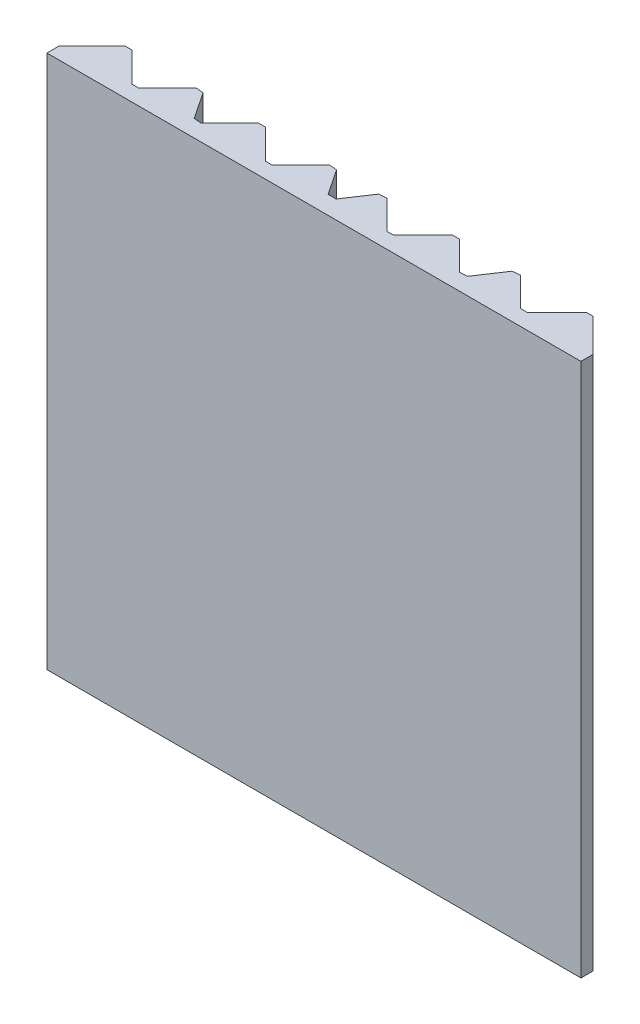
ISO-10303-21;
HEADER;
FILE_DESCRIPTION(('STEP AP214'),'2;1');
FILE_NAME('part.step','',(''),(''),'','','');
FILE_SCHEMA(('AUTOMOTIVE_DESIGN { 1 0 10303 214 1 1 1 1 }'));
ENDSEC;
DATA;
#1=APPLICATION_CONTEXT('core data for automotive mechanical design processes');
#2=APPLICATION_PROTOCOL_DEFINITION('international standard','automotive_design',2000,#1);
#3=PRODUCT_CONTEXT('',#1,'mechanical');
#4=PRODUCT('Part','Part','',(#3));
#5=PRODUCT_RELATED_PRODUCT_CATEGORY('part','',(#4));
#6=PRODUCT_DEFINITION_FORMATION('','',#4);
#7=PRODUCT_DEFINITION_CONTEXT('part definition',#1,'design');
#8=PRODUCT_DEFINITION('design','',#6,#7);
#9=PRODUCT_DEFINITION_SHAPE('','',#8);
#10=(LENGTH_UNIT() NAMED_UNIT(*) SI_UNIT(.MILLI.,.METRE.));
#11=(NAMED_UNIT(*) PLANE_ANGLE_UNIT() SI_UNIT($,.RADIAN.));
#12=(NAMED_UNIT(*) SI_UNIT($,.STERADIAN.) SOLID_ANGLE_UNIT());
#13=UNCERTAINTY_MEASURE_WITH_UNIT(LENGTH_MEASURE(1.E-05),#10,'distance_accuracy_value','');
#14=(GEOMETRIC_REPRESENTATION_CONTEXT(3) GLOBAL_UNCERTAINTY_ASSIGNED_CONTEXT((#13)) GLOBAL_UNIT_ASSIGNED_CONTEXT((#10,
#11,#12)) REPRESENTATION_CONTEXT('',''));
#15=CARTESIAN_POINT('',(0.,0.,0.));
#16=DIRECTION('',(0.,0.,1.));
#17=DIRECTION('',(1.,0.,0.));
#18=AXIS2_PLACEMENT_3D('',#15,#16,#17);
#19=CARTESIAN_POINT('',(101.6,-139.7,-6.35));
#20=DIRECTION('',(0.707106781186548,0.,0.707106781186548));
#21=DIRECTION('',(0.707106781186548,0.,-0.707106781186548));
#22=AXIS2_PLACEMENT_3D('',#19,#20,#21);
#23=PLANE('',#22);
#24=DIRECTION('',(0.,1.,0.));
#25=VECTOR('',#24,1.);
#26=CARTESIAN_POINT('',(103.396051224223,0.,-8.14605122421498));
#27=LINE('',#26,#25);
#28=CARTESIAN_POINT('',(103.396051224221,139.7,-8.14605122421689));
#29=VERTEX_POINT('',#28);
#30=CARTESIAN_POINT('',(103.396051224221,-139.7,-8.14605122421689));
#31=VERTEX_POINT('',#30);
#32=EDGE_CURVE('E19',#29,#31,#27,.F.);
#33=ORIENTED_EDGE('',*,*,#32,.F.);
#34=DIRECTION('',(-0.707106781186199,0.,0.707106781186896));
#35=VECTOR('',#34,1.);
#36=CARTESIAN_POINT('',(118.853948775777,139.7,-23.603948775785));
#37=LINE('',#36,#35);
#38=CARTESIAN_POINT('',(118.853948775779,139.7,-23.6039487757831));
#39=VERTEX_POINT('',#38);
#40=EDGE_CURVE('E244',#39,#29,#37,.T.);
#41=ORIENTED_EDGE('',*,*,#40,.F.);
#42=DIRECTION('',(0.,1.,0.));
#43=VECTOR('',#42,1.);
#44=CARTESIAN_POINT('',(118.853948775777,0.,-23.603948775785));
#45=LINE('',#44,#43);
#46=CARTESIAN_POINT('',(118.853948775778,-139.7,-23.6039487757841));
#47=VERTEX_POINT('',#46);
#48=EDGE_CURVE('E239',#47,#39,#45,.T.);
#49=ORIENTED_EDGE('',*,*,#48,.F.);
#50=DIRECTION('',(-0.707106781186199,0.,0.707106781186896));
#51=VECTOR('',#50,1.);
#52=CARTESIAN_POINT('',(118.853948775777,-139.7,-23.603948775785));
#53=LINE('',#52,#51);
#54=EDGE_CURVE('E241',#47,#31,#53,.T.);
#55=ORIENTED_EDGE('',*,*,#54,.T.);
#56=EDGE_LOOP('',(#33,#41,#49,#55));
#57=FACE_BOUND('',#56,.T.);
#58=ADVANCED_FACE('F16',(#57),#23,.F.);
#59=CARTESIAN_POINT('',(101.6,0.,-8.14605122421498));
#60=DIRECTION('',(0.,0.,-1.));
#61=DIRECTION('',(-1.,0.,0.));
#62=AXIS2_PLACEMENT_3D('',#59,#60,#61);
#63=PLANE('',#62);
#64=DIRECTION('',(1.,0.,0.));
#65=VECTOR('',#64,1.);
#66=CARTESIAN_POINT('',(0.,139.7,-8.14605122421498));
#67=LINE('',#66,#65);
#68=CARTESIAN_POINT('',(99.8039487757784,139.7,-8.14605122421593));
#69=VERTEX_POINT('',#68);
#70=EDGE_CURVE('E344',#29,#69,#67,.F.);
#71=ORIENTED_EDGE('',*,*,#70,.F.);
#72=ORIENTED_EDGE('',*,*,#32,.T.);
#73=DIRECTION('',(1.,0.,0.));
#74=VECTOR('',#73,1.);
#75=CARTESIAN_POINT('',(0.,-139.7,-8.14605122421498));
#76=LINE('',#75,#74);
#77=CARTESIAN_POINT('',(99.8039487757783,-139.7,-8.14605122421593));
#78=VERTEX_POINT('',#77);
#79=EDGE_CURVE('E256',#31,#78,#76,.F.);
#80=ORIENTED_EDGE('',*,*,#79,.T.);
#81=DIRECTION('',(0.,1.,0.));
#82=VECTOR('',#81,1.);
#83=CARTESIAN_POINT('',(99.8039487757812,-139.7,-8.14605122421879));
#84=LINE('',#83,#82);
#85=EDGE_CURVE('E337',#78,#69,#84,.T.);
#86=ORIENTED_EDGE('',*,*,#85,.T.);
#87=EDGE_LOOP('',(#71,#72,#80,#86));
#88=FACE_BOUND('',#87,.T.);
#89=ADVANCED_FACE('F342',(#88),#63,.T.);
#90=CARTESIAN_POINT('',(82.55,-139.7,-25.4));
#91=DIRECTION('',(-0.707106781186548,0.,0.707106781186548));
#92=DIRECTION('',(0.707106781186548,0.,0.707106781186548));
#93=AXIS2_PLACEMENT_3D('',#90,#91,#92);
#94=PLANE('',#93);
#95=ORIENTED_EDGE('',*,*,#85,.F.);
#96=DIRECTION('',(-0.707106781186369,0.,-0.707106781186727));
#97=VECTOR('',#96,1.);
#98=CARTESIAN_POINT('',(99.8039487757774,-139.7,-8.14605122421498));
#99=LINE('',#98,#97);
#100=CARTESIAN_POINT('',(84.7408302927782,-139.7,-23.2091697072214));
#101=VERTEX_POINT('',#100);
#102=EDGE_CURVE('E258',#78,#101,#99,.T.);
#103=ORIENTED_EDGE('',*,*,#102,.T.);
#104=DIRECTION('',(0.,1.,0.));
#105=VECTOR('',#104,1.);
#106=CARTESIAN_POINT('',(84.7408302927783,0.,-23.2091697072204));
#107=LINE('',#106,#105);
#108=CARTESIAN_POINT('',(84.7408302927782,139.7,-23.2091697072214));
#109=VERTEX_POINT('',#108);
#110=EDGE_CURVE('E335',#109,#101,#107,.F.);
#111=ORIENTED_EDGE('',*,*,#110,.F.);
#112=DIRECTION('',(-0.707106781186369,0.,-0.707106781186727));
#113=VECTOR('',#112,1.);
#114=CARTESIAN_POINT('',(99.8039487757774,139.7,-8.14605122421498));
#115=LINE('',#114,#113);
#116=EDGE_CURVE('E347',#69,#109,#115,.T.);
#117=ORIENTED_EDGE('',*,*,#116,.F.);
#118=EDGE_LOOP('',(#95,#103,#111,#117));
#119=FACE_BOUND('',#118,.T.);
#120=ADVANCED_FACE('F416',(#119),#94,.F.);
#121=CARTESIAN_POINT('',(82.7861008068678,0.,-23.0156133443201));
#122=DIRECTION('',(-0.0985376179666371,0.,-0.995133326668071));
#123=DIRECTION('',(-0.995133326668071,0.,0.0985376179666371));
#124=AXIS2_PLACEMENT_3D('',#121,#122,#123);
#125=PLANE('',#124);
#126=DIRECTION('',(0.,1.,0.));
#127=VECTOR('',#126,1.);
#128=CARTESIAN_POINT('',(80.8313713209504,-139.7,-22.8220569814256));
#129=LINE('',#128,#127);
#130=CARTESIAN_POINT('',(80.8313713209557,-139.7,-22.8220569814215));
#131=VERTEX_POINT('',#130);
#132=CARTESIAN_POINT('',(80.8313713209557,139.7,-22.8220569814215));
#133=VERTEX_POINT('',#132);
#134=EDGE_CURVE('E333',#131,#133,#129,.T.);
#135=ORIENTED_EDGE('',*,*,#134,.T.);
#136=DIRECTION('',(-0.995133326668063,0.,0.0985376179667174));
#137=VECTOR('',#136,1.);
#138=CARTESIAN_POINT('',(84.7408302927782,139.7,-23.2091697072218));
#139=LINE('',#138,#137);
#140=EDGE_CURVE('E423',#109,#133,#139,.T.);
#141=ORIENTED_EDGE('',*,*,#140,.F.);
#142=ORIENTED_EDGE('',*,*,#110,.T.);
#143=DIRECTION('',(-0.995133326668063,0.,0.0985376179667174));
#144=VECTOR('',#143,1.);
#145=CARTESIAN_POINT('',(84.7408302927782,-139.7,-23.2091697072218));
#146=LINE('',#145,#144);
#147=EDGE_CURVE('E414',#101,#131,#146,.T.);
#148=ORIENTED_EDGE('',*,*,#147,.T.);
#149=EDGE_LOOP('',(#135,#141,#142,#148));
#150=FACE_BOUND('',#149,.T.);
#151=ADVANCED_FACE('F420',(#150),#125,.T.);
#152=CARTESIAN_POINT('',(69.85,-139.7,-6.35));
#153=DIRECTION('',(0.832050294337844,0.,0.554700196225229));
#154=DIRECTION('',(0.554700196225229,0.,-0.832050294337844));
#155=AXIS2_PLACEMENT_3D('',#152,#153,#154);
#156=PLANE('',#155);
#157=DIRECTION('',(0.,1.,0.));
#158=VECTOR('',#157,1.);
#159=CARTESIAN_POINT('',(71.5686286790425,0.,-8.92794301858024));
#160=LINE('',#159,#158);
#161=CARTESIAN_POINT('',(71.5686286790461,139.7,-8.92794301857707));
#162=VERTEX_POINT('',#161);
#163=CARTESIAN_POINT('',(71.5686286790461,-139.7,-8.92794301857707));
#164=VERTEX_POINT('',#163);
#165=EDGE_CURVE('E330',#162,#164,#160,.F.);
#166=ORIENTED_EDGE('',*,*,#165,.F.);
#167=DIRECTION('',(-0.554700196226072,0.,0.832050294337282));
#168=VECTOR('',#167,1.);
#169=CARTESIAN_POINT('',(80.8313713209574,139.7,-22.8220569814209));
#170=LINE('',#169,#168);
#171=EDGE_CURVE('E440',#133,#162,#170,.T.);
#172=ORIENTED_EDGE('',*,*,#171,.F.);
#173=ORIENTED_EDGE('',*,*,#134,.F.);
#174=DIRECTION('',(-0.554700196226072,0.,0.832050294337282));
#175=VECTOR('',#174,1.);
#176=CARTESIAN_POINT('',(80.8313713209574,-139.7,-22.8220569814209));
#177=LINE('',#176,#175);
#178=EDGE_CURVE('E412',#131,#164,#177,.T.);
#179=ORIENTED_EDGE('',*,*,#178,.T.);
#180=EDGE_LOOP('',(#166,#172,#173,#179));
#181=FACE_BOUND('',#180,.T.);
#182=ADVANCED_FACE('F428',(#181),#156,.F.);
#183=CARTESIAN_POINT('',(69.6138991931322,0.,-8.73438665567994));
#184=DIRECTION('',(-0.0985376179666371,0.,-0.995133326668071));
#185=DIRECTION('',(-0.995133326668071,0.,0.0985376179666371));
#186=AXIS2_PLACEMENT_3D('',#183,#184,#185);
#187=PLANE('',#186);
#188=DIRECTION('',(-0.995133326668063,0.,0.0985376179667165));
#189=VECTOR('',#188,1.);
#190=CARTESIAN_POINT('',(71.5686286790426,139.7,-8.92794301857914));
#191=LINE('',#190,#189);
#192=CARTESIAN_POINT('',(67.6591697072217,139.7,-8.54083029277891));
#193=VERTEX_POINT('',#192);
#194=EDGE_CURVE('E435',#162,#193,#191,.T.);
#195=ORIENTED_EDGE('',*,*,#194,.F.);
#196=ORIENTED_EDGE('',*,*,#165,.T.);
#197=DIRECTION('',(-0.995133326668063,0.,0.0985376179667165));
#198=VECTOR('',#197,1.);
#199=CARTESIAN_POINT('',(71.5686286790426,-139.7,-8.92794301857914));
#200=LINE('',#199,#198);
#201=CARTESIAN_POINT('',(67.6591697072217,-139.7,-8.54083029277891));
#202=VERTEX_POINT('',#201);
#203=EDGE_CURVE('E410',#164,#202,#200,.T.);
#204=ORIENTED_EDGE('',*,*,#203,.T.);
#205=DIRECTION('',(0.,1.,0.));
#206=VECTOR('',#205,1.);
#207=CARTESIAN_POINT('',(67.6591697072218,-139.7,-8.5408302927782));
#208=LINE('',#207,#206);
#209=EDGE_CURVE('E328',#202,#193,#208,.T.);
#210=ORIENTED_EDGE('',*,*,#209,.T.);
#211=EDGE_LOOP('',(#195,#196,#204,#210));
#212=FACE_BOUND('',#211,.T.);
#213=ADVANCED_FACE('F432',(#212),#187,.T.);
#214=CARTESIAN_POINT('',(50.8,-139.7,-25.4));
#215=DIRECTION('',(-0.707106781186548,0.,0.707106781186548));
#216=DIRECTION('',(0.707106781186548,0.,0.707106781186548));
#217=AXIS2_PLACEMENT_3D('',#214,#215,#216);
#218=PLANE('',#217);
#219=ORIENTED_EDGE('',*,*,#209,.F.);
#220=DIRECTION('',(-0.707106781186369,0.,-0.707106781186726));
#221=VECTOR('',#220,1.);
#222=CARTESIAN_POINT('',(67.6591697072218,-139.7,-8.5408302927782));
#223=LINE('',#222,#221);
#224=CARTESIAN_POINT('',(52.5960512242207,-139.7,-23.6039487757831));
#225=VERTEX_POINT('',#224);
#226=EDGE_CURVE('E408',#202,#225,#223,.T.);
#227=ORIENTED_EDGE('',*,*,#226,.T.);
#228=DIRECTION('',(0.,1.,0.));
#229=VECTOR('',#228,1.);
#230=CARTESIAN_POINT('',(52.5960512242226,0.,-23.603948775785));
#231=LINE('',#230,#229);
#232=CARTESIAN_POINT('',(52.5960512242207,139.7,-23.6039487757831));
#233=VERTEX_POINT('',#232);
#234=EDGE_CURVE('E325',#233,#225,#231,.F.);
#235=ORIENTED_EDGE('',*,*,#234,.F.);
#236=DIRECTION('',(-0.707106781186369,0.,-0.707106781186726));
#237=VECTOR('',#236,1.);
#238=CARTESIAN_POINT('',(67.6591697072218,139.7,-8.5408302927782));
#239=LINE('',#238,#237);
#240=EDGE_CURVE('E439',#193,#233,#239,.T.);
#241=ORIENTED_EDGE('',*,*,#240,.F.);
#242=EDGE_LOOP('',(#219,#227,#235,#241));
#243=FACE_BOUND('',#242,.T.);
#244=ADVANCED_FACE('F630',(#243),#218,.F.);
#245=CARTESIAN_POINT('',(50.8,0.,-23.603948775785));
#246=DIRECTION('',(0.,0.,-1.));
#247=DIRECTION('',(-1.,0.,0.));
#248=AXIS2_PLACEMENT_3D('',#245,#246,#247);
#249=PLANE('',#248);
#250=DIRECTION('',(0.,1.,0.));
#251=VECTOR('',#250,1.);
#252=CARTESIAN_POINT('',(49.0039487757812,-139.7,-23.6039487757812));
#253=LINE('',#252,#251);
#254=CARTESIAN_POINT('',(49.0039487757783,-139.7,-23.6039487757841));
#255=VERTEX_POINT('',#254);
#256=CARTESIAN_POINT('',(49.0039487757783,139.7,-23.6039487757841));
#257=VERTEX_POINT('',#256);
#258=EDGE_CURVE('E323',#255,#257,#253,.T.);
#259=ORIENTED_EDGE('',*,*,#258,.T.);
#260=DIRECTION('',(1.,0.,0.));
#261=VECTOR('',#260,1.);
#262=CARTESIAN_POINT('',(0.,139.7,-23.603948775785));
#263=LINE('',#262,#261);
#264=EDGE_CURVE('E446',#233,#257,#263,.F.);
#265=ORIENTED_EDGE('',*,*,#264,.F.);
#266=ORIENTED_EDGE('',*,*,#234,.T.);
#267=DIRECTION('',(1.,0.,0.));
#268=VECTOR('',#267,1.);
#269=CARTESIAN_POINT('',(0.,-139.7,-23.603948775785));
#270=LINE('',#269,#268);
#271=EDGE_CURVE('E406',#225,#255,#270,.F.);
#272=ORIENTED_EDGE('',*,*,#271,.T.);
#273=EDGE_LOOP('',(#259,#265,#266,#272));
#274=FACE_BOUND('',#273,.T.);
#275=ADVANCED_FACE('F627',(#274),#249,.T.);
#276=CARTESIAN_POINT('',(31.75,-139.7,-6.35));
#277=DIRECTION('',(0.707106781186548,0.,0.707106781186548));
#278=DIRECTION('',(0.707106781186548,0.,-0.707106781186548));
#279=AXIS2_PLACEMENT_3D('',#276,#277,#278);
#280=PLANE('',#279);
#281=DIRECTION('',(0.,1.,0.));
#282=VECTOR('',#281,1.);
#283=CARTESIAN_POINT('',(33.5460512242226,0.,-8.14605122421498));
#284=LINE('',#283,#282);
#285=CARTESIAN_POINT('',(33.5460512242207,139.7,-8.14605122421688));
#286=VERTEX_POINT('',#285);
#287=CARTESIAN_POINT('',(33.5460512242207,-139.7,-8.14605122421688));
#288=VERTEX_POINT('',#287);
#289=EDGE_CURVE('E320',#286,#288,#284,.F.);
#290=ORIENTED_EDGE('',*,*,#289,.F.);
#291=DIRECTION('',(-0.707106781186199,0.,0.707106781186896));
#292=VECTOR('',#291,1.);
#293=CARTESIAN_POINT('',(49.0039487757774,139.7,-23.603948775785));
#294=LINE('',#293,#292);
#295=EDGE_CURVE('E449',#257,#286,#294,.T.);
#296=ORIENTED_EDGE('',*,*,#295,.F.);
#297=ORIENTED_EDGE('',*,*,#258,.F.);
#298=DIRECTION('',(-0.707106781186199,0.,0.707106781186896));
#299=VECTOR('',#298,1.);
#300=CARTESIAN_POINT('',(49.0039487757774,-139.7,-23.603948775785));
#301=LINE('',#300,#299);
#302=EDGE_CURVE('E404',#255,#288,#301,.T.);
#303=ORIENTED_EDGE('',*,*,#302,.T.);
#304=EDGE_LOOP('',(#290,#296,#297,#303));
#305=FACE_BOUND('',#304,.T.);
#306=ADVANCED_FACE('F623',(#305),#280,.F.);
#307=CARTESIAN_POINT('',(31.75,0.,-8.14605122421498));
#308=DIRECTION('',(0.,0.,-1.));
#309=DIRECTION('',(-1.,0.,0.));
#310=AXIS2_PLACEMENT_3D('',#307,#308,#309);
#311=PLANE('',#310);
#312=DIRECTION('',(1.,0.,0.));
#313=VECTOR('',#312,1.);
#314=CARTESIAN_POINT('',(0.,139.7,-8.14605122421498));
#315=LINE('',#314,#313);
#316=CARTESIAN_POINT('',(29.9539487757784,139.7,-8.14605122421593));
#317=VERTEX_POINT('',#316);
#318=EDGE_CURVE('E452',#286,#317,#315,.F.);
#319=ORIENTED_EDGE('',*,*,#318,.F.);
#320=ORIENTED_EDGE('',*,*,#289,.T.);
#321=DIRECTION('',(1.,0.,0.));
#322=VECTOR('',#321,1.);
#323=CARTESIAN_POINT('',(0.,-139.7,-8.14605122421498));
#324=LINE('',#323,#322);
#325=CARTESIAN_POINT('',(29.9539487757784,-139.7,-8.14605122421593));
#326=VERTEX_POINT('',#325);
#327=EDGE_CURVE('E402',#288,#326,#324,.F.);
#328=ORIENTED_EDGE('',*,*,#327,.T.);
#329=DIRECTION('',(0.,1.,0.));
#330=VECTOR('',#329,1.);
#331=CARTESIAN_POINT('',(29.9539487757812,-139.7,-8.14605122421879));
#332=LINE('',#331,#330);
#333=EDGE_CURVE('E318',#326,#317,#332,.T.);
#334=ORIENTED_EDGE('',*,*,#333,.T.);
#335=EDGE_LOOP('',(#319,#320,#328,#334));
#336=FACE_BOUND('',#335,.T.);
#337=ADVANCED_FACE('F620',(#336),#311,.T.);
#338=CARTESIAN_POINT('',(12.7,-139.7,-25.4));
#339=DIRECTION('',(-0.707106781186548,0.,0.707106781186548));
#340=DIRECTION('',(0.707106781186548,0.,0.707106781186548));
#341=AXIS2_PLACEMENT_3D('',#338,#339,#340);
#342=PLANE('',#341);
#343=ORIENTED_EDGE('',*,*,#333,.F.);
#344=DIRECTION('',(-0.707106781186369,0.,-0.707106781186726));
#345=VECTOR('',#344,1.);
#346=CARTESIAN_POINT('',(29.9539487757774,-139.7,-8.14605122421498));
#347=LINE('',#346,#345);
#348=CARTESIAN_POINT('',(14.8908302927782,-139.7,-23.2091697072216));
#349=VERTEX_POINT('',#348);
#350=EDGE_CURVE('E400',#326,#349,#347,.T.);
#351=ORIENTED_EDGE('',*,*,#350,.T.);
#352=DIRECTION('',(0.,1.,0.));
#353=VECTOR('',#352,1.);
#354=CARTESIAN_POINT('',(14.8908302927783,0.,-23.2091697072209));
#355=LINE('',#354,#353);
#356=CARTESIAN_POINT('',(14.8908302927782,139.7,-23.2091697072216));
#357=VERTEX_POINT('',#356);
#358=EDGE_CURVE('E315',#357,#349,#355,.F.);
#359=ORIENTED_EDGE('',*,*,#358,.F.);
#360=DIRECTION('',(-0.707106781186369,0.,-0.707106781186726));
#361=VECTOR('',#360,1.);
#362=CARTESIAN_POINT('',(29.9539487757774,139.7,-8.14605122421498));
#363=LINE('',#362,#361);
#364=EDGE_CURVE('E455',#317,#357,#363,.T.);
#365=ORIENTED_EDGE('',*,*,#364,.F.);
#366=EDGE_LOOP('',(#343,#351,#359,#365));
#367=FACE_BOUND('',#366,.T.);
#368=ADVANCED_FACE('F616',(#367),#342,.F.);
#369=CARTESIAN_POINT('',(12.9361008068627,0.,-23.0156133443201));
#370=DIRECTION('',(-0.0985376179666371,0.,-0.995133326668071));
#371=DIRECTION('',(-0.995133326668071,0.,0.0985376179666371));
#372=AXIS2_PLACEMENT_3D('',#369,#370,#371);
#373=PLANE('',#372);
#374=DIRECTION('',(0.,1.,0.));
#375=VECTOR('',#374,1.);
#376=CARTESIAN_POINT('',(10.9813713209472,-139.7,-22.8220569814209));
#377=LINE('',#376,#375);
#378=CARTESIAN_POINT('',(10.9813713209473,-139.7,-22.8220569814201));
#379=VERTEX_POINT('',#378);
#380=CARTESIAN_POINT('',(10.9813713209473,139.7,-22.8220569814201));
#381=VERTEX_POINT('',#380);
#382=EDGE_CURVE('E313',#379,#381,#377,.T.);
#383=ORIENTED_EDGE('',*,*,#382,.T.);
#384=DIRECTION('',(-0.995133326668088,0.,0.0985376179664637));
#385=VECTOR('',#384,1.);
#386=CARTESIAN_POINT('',(14.8908302927782,139.7,-23.2091697072218));
#387=LINE('',#386,#385);
#388=EDGE_CURVE('E458',#357,#381,#387,.T.);
#389=ORIENTED_EDGE('',*,*,#388,.F.);
#390=ORIENTED_EDGE('',*,*,#358,.T.);
#391=DIRECTION('',(-0.995133326668088,0.,0.0985376179664637));
#392=VECTOR('',#391,1.);
#393=CARTESIAN_POINT('',(14.8908302927782,-139.7,-23.2091697072218));
#394=LINE('',#393,#392);
#395=EDGE_CURVE('E398',#349,#379,#394,.T.);
#396=ORIENTED_EDGE('',*,*,#395,.T.);
#397=EDGE_LOOP('',(#383,#389,#390,#396));
#398=FACE_BOUND('',#397,.T.);
#399=ADVANCED_FACE('F610',(#398),#373,.T.);
#400=CARTESIAN_POINT('',(0.,-139.7,-6.35));
#401=DIRECTION('',(0.832050294337844,0.,0.554700196225229));
#402=DIRECTION('',(0.554700196225229,0.,-0.832050294337844));
#403=AXIS2_PLACEMENT_3D('',#400,#401,#402);
#404=PLANE('',#403);
#405=DIRECTION('',(0.,1.,0.));
#406=VECTOR('',#405,1.);
#407=CARTESIAN_POINT('',(2.11340774761801,0.,-9.52011162142778));
#408=LINE('',#407,#406);
#409=CARTESIAN_POINT('',(2.11340774761819,139.7,-9.52011162142766));
#410=VERTEX_POINT('',#409);
#411=CARTESIAN_POINT('',(2.11340774761819,-139.7,-9.52011162142766));
#412=VERTEX_POINT('',#411);
#413=EDGE_CURVE('E310',#410,#412,#408,.F.);
#414=ORIENTED_EDGE('',*,*,#413,.F.);
#415=DIRECTION('',(-0.554700196225251,0.,0.832050294337829));
#416=VECTOR('',#415,1.);
#417=CARTESIAN_POINT('',(10.9813713209472,139.7,-22.8220569814209));
#418=LINE('',#417,#416);
#419=EDGE_CURVE('E461',#381,#410,#418,.T.);
#420=ORIENTED_EDGE('',*,*,#419,.F.);
#421=ORIENTED_EDGE('',*,*,#382,.F.);
#422=DIRECTION('',(-0.554700196225251,0.,0.832050294337829));
#423=VECTOR('',#422,1.);
#424=CARTESIAN_POINT('',(10.9813713209472,-139.7,-22.8220569814209));
#425=LINE('',#424,#423);
#426=EDGE_CURVE('E396',#379,#412,#425,.T.);
#427=ORIENTED_EDGE('',*,*,#426,.T.);
#428=EDGE_LOOP('',(#414,#420,#421,#427));
#429=FACE_BOUND('',#428,.T.);
#430=ADVANCED_FACE('F606',(#429),#404,.F.);
#431=CARTESIAN_POINT('',(0.,0.,-9.52011162142778));
#432=DIRECTION('',(0.,0.,-1.));
#433=DIRECTION('',(-1.,0.,0.));
#434=AXIS2_PLACEMENT_3D('',#431,#432,#433);
#435=PLANE('',#434);
#436=DIRECTION('',(1.,0.,0.));
#437=VECTOR('',#436,1.);
#438=CARTESIAN_POINT('',(0.,-139.7,-9.52011162142778));
#439=LINE('',#438,#437);
#440=CARTESIAN_POINT('',(-2.1134077476181,-139.7,-9.52011162142772));
#441=VERTEX_POINT('',#440);
#442=EDGE_CURVE('E394',#412,#441,#439,.F.);
#443=ORIENTED_EDGE('',*,*,#442,.T.);
#444=DIRECTION('',(0.,1.,0.));
#445=VECTOR('',#444,1.);
#446=CARTESIAN_POINT('',(-2.11340774761836,-139.7,-9.52011162142755));
#447=LINE('',#446,#445);
#448=CARTESIAN_POINT('',(-2.1134077476181,139.7,-9.52011162142772));
#449=VERTEX_POINT('',#448);
#450=EDGE_CURVE('E307',#449,#441,#447,.F.);
#451=ORIENTED_EDGE('',*,*,#450,.F.);
#452=DIRECTION('',(1.,0.,0.));
#453=VECTOR('',#452,1.);
#454=CARTESIAN_POINT('',(0.,139.7,-9.52011162142778));
#455=LINE('',#454,#453);
#456=EDGE_CURVE('E464',#410,#449,#455,.F.);
#457=ORIENTED_EDGE('',*,*,#456,.F.);
#458=ORIENTED_EDGE('',*,*,#413,.T.);
#459=EDGE_LOOP('',(#443,#451,#457,#458));
#460=FACE_BOUND('',#459,.T.);
#461=ADVANCED_FACE('F602',(#460),#435,.T.);
#462=CARTESIAN_POINT('',(0.,-139.7,-6.35));
#463=DIRECTION('',(0.832050294337844,0.,-0.554700196225229));
#464=DIRECTION('',(-0.554700196225229,0.,-0.832050294337844));
#465=AXIS2_PLACEMENT_3D('',#462,#463,#464);
#466=PLANE('',#465);
#467=DIRECTION('',(-0.554700196225251,0.,-0.832050294337829));
#468=VECTOR('',#467,1.);
#469=CARTESIAN_POINT('',(-2.11340774761801,-139.7,-9.52011162142778));
#470=LINE('',#469,#468);
#471=CARTESIAN_POINT('',(-10.9813713209473,-139.7,-22.8220569814205));
#472=VERTEX_POINT('',#471);
#473=EDGE_CURVE('E392',#441,#472,#470,.T.);
#474=ORIENTED_EDGE('',*,*,#473,.T.);
#475=DIRECTION('',(0.,1.,0.));
#476=VECTOR('',#475,1.);
#477=CARTESIAN_POINT('',(-10.9813713209474,3.383959779057E-13,-22.8220569814193));
#478=LINE('',#477,#476);
#479=CARTESIAN_POINT('',(-10.9813713209473,139.7,-22.8220569814205));
#480=VERTEX_POINT('',#479);
#481=EDGE_CURVE('E304',#480,#472,#478,.F.);
#482=ORIENTED_EDGE('',*,*,#481,.F.);
#483=DIRECTION('',(-0.554700196225251,0.,-0.832050294337829));
#484=VECTOR('',#483,1.);
#485=CARTESIAN_POINT('',(-2.11340774761801,139.7,-9.52011162142778));
#486=LINE('',#485,#484);
#487=EDGE_CURVE('E467',#449,#480,#486,.T.);
#488=ORIENTED_EDGE('',*,*,#487,.F.);
#489=ORIENTED_EDGE('',*,*,#450,.T.);
#490=EDGE_LOOP('',(#474,#482,#488,#489));
#491=FACE_BOUND('',#490,.T.);
#492=ADVANCED_FACE('F597',(#491),#466,.T.);
#493=CARTESIAN_POINT('',(-12.9361008068627,3.383959779057E-13,-23.0156133443201));
#494=DIRECTION('',(0.0985376179666371,0.,-0.995133326668071));
#495=DIRECTION('',(-0.995133326668071,0.,-0.0985376179666371));
#496=AXIS2_PLACEMENT_3D('',#493,#494,#495);
#497=PLANE('',#496);
#498=ORIENTED_EDGE('',*,*,#481,.T.);
#499=DIRECTION('',(-0.995133326668088,0.,-0.0985376179664637));
#500=VECTOR('',#499,1.);
#501=CARTESIAN_POINT('',(-10.9813713209472,-139.7,-22.8220569814209));
#502=LINE('',#501,#500);
#503=CARTESIAN_POINT('',(-14.8908302927782,-139.7,-23.2091697072213));
#504=VERTEX_POINT('',#503);
#505=EDGE_CURVE('E390',#472,#504,#502,.T.);
#506=ORIENTED_EDGE('',*,*,#505,.T.);
#507=DIRECTION('',(0.,1.,0.));
#508=VECTOR('',#507,1.);
#509=CARTESIAN_POINT('',(-14.8908302927782,-139.7,-23.2091697072218));
#510=LINE('',#509,#508);
#511=CARTESIAN_POINT('',(-14.8908302927782,139.7,-23.2091697072213));
#512=VERTEX_POINT('',#511);
#513=EDGE_CURVE('E301',#512,#504,#510,.F.);
#514=ORIENTED_EDGE('',*,*,#513,.F.);
#515=DIRECTION('',(-0.995133326668088,0.,-0.0985376179664637));
#516=VECTOR('',#515,1.);
#517=CARTESIAN_POINT('',(-10.9813713209472,139.7,-22.8220569814209));
#518=LINE('',#517,#516);
#519=EDGE_CURVE('E470',#480,#512,#518,.T.);
#520=ORIENTED_EDGE('',*,*,#519,.F.);
#521=EDGE_LOOP('',(#498,#506,#514,#520));
#522=FACE_BOUND('',#521,.T.);
#523=ADVANCED_FACE('F594',(#522),#497,.T.);
#524=CARTESIAN_POINT('',(-12.7,-139.7,-25.4));
#525=DIRECTION('',(-0.707106781186548,0.,-0.707106781186548));
#526=DIRECTION('',(-0.707106781186548,0.,0.707106781186548));
#527=AXIS2_PLACEMENT_3D('',#524,#525,#526);
#528=PLANE('',#527);
#529=DIRECTION('',(-0.707106781186369,0.,0.707106781186726));
#530=VECTOR('',#529,1.);
#531=CARTESIAN_POINT('',(-14.8908302927782,139.7,-23.2091697072218));
#532=LINE('',#531,#530);
#533=CARTESIAN_POINT('',(-29.9539487757793,139.7,-8.14605122421688));
#534=VERTEX_POINT('',#533);
#535=EDGE_CURVE('E473',#512,#534,#532,.T.);
#536=ORIENTED_EDGE('',*,*,#535,.F.);
#537=ORIENTED_EDGE('',*,*,#513,.T.);
#538=DIRECTION('',(-0.707106781186369,0.,0.707106781186726));
#539=VECTOR('',#538,1.);
#540=CARTESIAN_POINT('',(-14.8908302927782,-139.7,-23.2091697072218));
#541=LINE('',#540,#539);
#542=CARTESIAN_POINT('',(-29.9539487757793,-139.7,-8.14605122421688));
#543=VERTEX_POINT('',#542);
#544=EDGE_CURVE('E388',#504,#543,#541,.T.);
#545=ORIENTED_EDGE('',*,*,#544,.T.);
#546=DIRECTION('',(0.,1.,0.));
#547=VECTOR('',#546,1.);
#548=CARTESIAN_POINT('',(-29.9539487757774,0.,-8.14605122421498));
#549=LINE('',#548,#547);
#550=EDGE_CURVE('E298',#534,#543,#549,.F.);
#551=ORIENTED_EDGE('',*,*,#550,.F.);
#552=EDGE_LOOP('',(#536,#537,#545,#551));
#553=FACE_BOUND('',#552,.T.);
#554=ADVANCED_FACE('F591',(#553),#528,.T.);
#555=CARTESIAN_POINT('',(-31.75,0.,-8.14605122421498));
#556=DIRECTION('',(0.,0.,-1.));
#557=DIRECTION('',(-1.,0.,0.));
#558=AXIS2_PLACEMENT_3D('',#555,#556,#557);
#559=PLANE('',#558);
#560=DIRECTION('',(1.,0.,0.));
#561=VECTOR('',#560,1.);
#562=CARTESIAN_POINT('',(0.,-139.7,-8.14605122421498));
#563=LINE('',#562,#561);
#564=CARTESIAN_POINT('',(-33.5460512242216,-139.7,-8.14605122421593));
#565=VERTEX_POINT('',#564);
#566=EDGE_CURVE('E386',#543,#565,#563,.F.);
#567=ORIENTED_EDGE('',*,*,#566,.T.);
#568=DIRECTION('',(0.,1.,0.));
#569=VECTOR('',#568,1.);
#570=CARTESIAN_POINT('',(-33.5460512242188,-139.7,-8.14605122421879));
#571=LINE('',#570,#569);
#572=CARTESIAN_POINT('',(-33.5460512242216,139.7,-8.14605122421593));
#573=VERTEX_POINT('',#572);
#574=EDGE_CURVE('E295',#573,#565,#571,.F.);
#575=ORIENTED_EDGE('',*,*,#574,.F.);
#576=DIRECTION('',(1.,0.,0.));
#577=VECTOR('',#576,1.);
#578=CARTESIAN_POINT('',(0.,139.7,-8.14605122421498));
#579=LINE('',#578,#577);
#580=EDGE_CURVE('E476',#534,#573,#579,.F.);
#581=ORIENTED_EDGE('',*,*,#580,.F.);
#582=ORIENTED_EDGE('',*,*,#550,.T.);
#583=EDGE_LOOP('',(#567,#575,#581,#582));
#584=FACE_BOUND('',#583,.T.);
#585=ADVANCED_FACE('F585',(#584),#559,.T.);
#586=CARTESIAN_POINT('',(-31.75,-139.7,-6.35));
#587=DIRECTION('',(0.707106781186548,0.,-0.707106781186548));
#588=DIRECTION('',(-0.707106781186548,0.,-0.707106781186548));
#589=AXIS2_PLACEMENT_3D('',#586,#587,#588);
#590=PLANE('',#589);
#591=DIRECTION('',(-0.707106781186199,0.,-0.707106781186896));
#592=VECTOR('',#591,1.);
#593=CARTESIAN_POINT('',(-33.5460512242226,-139.7,-8.14605122421498));
#594=LINE('',#593,#592);
#595=CARTESIAN_POINT('',(-49.0039487757793,-139.7,-23.6039487757831));
#596=VERTEX_POINT('',#595);
#597=EDGE_CURVE('E384',#565,#596,#594,.T.);
#598=ORIENTED_EDGE('',*,*,#597,.T.);
#599=DIRECTION('',(0.,1.,0.));
#600=VECTOR('',#599,1.);
#601=CARTESIAN_POINT('',(-49.0039487757774,0.,-23.603948775785));
#602=LINE('',#601,#600);
#603=CARTESIAN_POINT('',(-49.0039487757793,139.7,-23.6039487757831));
#604=VERTEX_POINT('',#603);
#605=EDGE_CURVE('E292',#604,#596,#602,.F.);
#606=ORIENTED_EDGE('',*,*,#605,.F.);
#607=DIRECTION('',(-0.707106781186199,0.,-0.707106781186896));
#608=VECTOR('',#607,1.);
#609=CARTESIAN_POINT('',(-33.5460512242226,139.7,-8.14605122421498));
#610=LINE('',#609,#608);
#611=EDGE_CURVE('E479',#573,#604,#610,.T.);
#612=ORIENTED_EDGE('',*,*,#611,.F.);
#613=ORIENTED_EDGE('',*,*,#574,.T.);
#614=EDGE_LOOP('',(#598,#606,#612,#613));
#615=FACE_BOUND('',#614,.T.);
#616=ADVANCED_FACE('F582',(#615),#590,.T.);
#617=CARTESIAN_POINT('',(-50.8,0.,-23.603948775785));
#618=DIRECTION('',(0.,0.,-1.));
#619=DIRECTION('',(-1.,0.,0.));
#620=AXIS2_PLACEMENT_3D('',#617,#618,#619);
#621=PLANE('',#620);
#622=ORIENTED_EDGE('',*,*,#605,.T.);
#623=DIRECTION('',(1.,0.,0.));
#624=VECTOR('',#623,1.);
#625=CARTESIAN_POINT('',(0.,-139.7,-23.603948775785));
#626=LINE('',#625,#624);
#627=CARTESIAN_POINT('',(-52.5960512242216,-139.7,-23.6039487757841));
#628=VERTEX_POINT('',#627);
#629=EDGE_CURVE('E382',#596,#628,#626,.F.);
#630=ORIENTED_EDGE('',*,*,#629,.T.);
#631=DIRECTION('',(0.,1.,0.));
#632=VECTOR('',#631,1.);
#633=CARTESIAN_POINT('',(-52.5960512242188,-139.7,-23.6039487757812));
#634=LINE('',#633,#632);
#635=CARTESIAN_POINT('',(-52.5960512242216,139.7,-23.6039487757841));
#636=VERTEX_POINT('',#635);
#637=EDGE_CURVE('E289',#636,#628,#634,.F.);
#638=ORIENTED_EDGE('',*,*,#637,.F.);
#639=DIRECTION('',(1.,0.,0.));
#640=VECTOR('',#639,1.);
#641=CARTESIAN_POINT('',(0.,139.7,-23.603948775785));
#642=LINE('',#641,#640);
#643=EDGE_CURVE('E482',#604,#636,#642,.F.);
#644=ORIENTED_EDGE('',*,*,#643,.F.);
#645=EDGE_LOOP('',(#622,#630,#638,#644));
#646=FACE_BOUND('',#645,.T.);
#647=ADVANCED_FACE('F578',(#646),#621,.T.);
#648=CARTESIAN_POINT('',(-50.8,-139.7,-25.4));
#649=DIRECTION('',(-0.707106781186548,0.,-0.707106781186548));
#650=DIRECTION('',(-0.707106781186548,0.,0.707106781186548));
#651=AXIS2_PLACEMENT_3D('',#648,#649,#650);
#652=PLANE('',#651);
#653=DIRECTION('',(-0.707106781186369,0.,0.707106781186726));
#654=VECTOR('',#653,1.);
#655=CARTESIAN_POINT('',(-52.5960512242226,139.7,-23.603948775785));
#656=LINE('',#655,#654);
#657=CARTESIAN_POINT('',(-67.6591697072218,139.7,-8.54083029277855));
#658=VERTEX_POINT('',#657);
#659=EDGE_CURVE('E485',#636,#658,#656,.T.);
#660=ORIENTED_EDGE('',*,*,#659,.F.);
#661=ORIENTED_EDGE('',*,*,#637,.T.);
#662=DIRECTION('',(-0.707106781186369,0.,0.707106781186726));
#663=VECTOR('',#662,1.);
#664=CARTESIAN_POINT('',(-52.5960512242226,-139.7,-23.603948775785));
#665=LINE('',#664,#663);
#666=CARTESIAN_POINT('',(-67.6591697072218,-139.7,-8.54083029277855));
#667=VERTEX_POINT('',#666);
#668=EDGE_CURVE('E380',#628,#667,#665,.T.);
#669=ORIENTED_EDGE('',*,*,#668,.T.);
#670=DIRECTION('',(0.,1.,0.));
#671=VECTOR('',#670,1.);
#672=CARTESIAN_POINT('',(-67.6591697072217,0.,-8.54083029277961));
#673=LINE('',#672,#671);
#674=EDGE_CURVE('E286',#658,#667,#673,.F.);
#675=ORIENTED_EDGE('',*,*,#674,.F.);
#676=EDGE_LOOP('',(#660,#661,#669,#675));
#677=FACE_BOUND('',#676,.T.);
#678=ADVANCED_FACE('F573',(#677),#652,.T.);
#679=CARTESIAN_POINT('',(-69.6138991931322,0.,-8.73438665567994));
#680=DIRECTION('',(0.0985376179666371,0.,-0.995133326668071));
#681=DIRECTION('',(-0.995133326668071,0.,-0.0985376179666371));
#682=AXIS2_PLACEMENT_3D('',#679,#680,#681);
#683=PLANE('',#682);
#684=DIRECTION('',(-0.995133326668063,0.,-0.0985376179667165));
#685=VECTOR('',#684,1.);
#686=CARTESIAN_POINT('',(-67.6591697072218,-139.7,-8.5408302927782));
#687=LINE('',#686,#685);
#688=CARTESIAN_POINT('',(-71.5686286790443,-139.7,-8.92794301857852));
#689=VERTEX_POINT('',#688);
#690=EDGE_CURVE('E378',#667,#689,#687,.T.);
#691=ORIENTED_EDGE('',*,*,#690,.T.);
#692=DIRECTION('',(0.,1.,0.));
#693=VECTOR('',#692,1.);
#694=CARTESIAN_POINT('',(-71.5686286790496,-139.7,-8.92794301857445));
#695=LINE('',#694,#693);
#696=CARTESIAN_POINT('',(-71.5686286790443,139.7,-8.92794301857852));
#697=VERTEX_POINT('',#696);
#698=EDGE_CURVE('E283',#697,#689,#695,.F.);
#699=ORIENTED_EDGE('',*,*,#698,.F.);
#700=DIRECTION('',(-0.995133326668063,0.,-0.0985376179667165));
#701=VECTOR('',#700,1.);
#702=CARTESIAN_POINT('',(-67.6591697072218,139.7,-8.5408302927782));
#703=LINE('',#702,#701);
#704=EDGE_CURVE('E488',#658,#697,#703,.T.);
#705=ORIENTED_EDGE('',*,*,#704,.F.);
#706=ORIENTED_EDGE('',*,*,#674,.T.);
#707=EDGE_LOOP('',(#691,#699,#705,#706));
#708=FACE_BOUND('',#707,.T.);
#709=ADVANCED_FACE('F570',(#708),#683,.T.);
#710=CARTESIAN_POINT('',(-69.85,-139.7,-6.35));
#711=DIRECTION('',(0.832050294337844,0.,-0.554700196225229));
#712=DIRECTION('',(-0.554700196225229,0.,-0.832050294337844));
#713=AXIS2_PLACEMENT_3D('',#710,#711,#712);
#714=PLANE('',#713);
#715=DIRECTION('',(-0.554700196226072,0.,-0.832050294337282));
#716=VECTOR('',#715,1.);
#717=CARTESIAN_POINT('',(-71.5686286790426,-139.7,-8.92794301857914));
#718=LINE('',#717,#716);
#719=CARTESIAN_POINT('',(-80.8313713209539,-139.7,-22.8220569814229));
#720=VERTEX_POINT('',#719);
#721=EDGE_CURVE('E376',#689,#720,#718,.T.);
#722=ORIENTED_EDGE('',*,*,#721,.T.);
#723=DIRECTION('',(0.,1.,0.));
#724=VECTOR('',#723,1.);
#725=CARTESIAN_POINT('',(-80.8313713209575,0.,-22.8220569814198));
#726=LINE('',#725,#724);
#727=CARTESIAN_POINT('',(-80.8313713209539,139.7,-22.8220569814229));
#728=VERTEX_POINT('',#727);
#729=EDGE_CURVE('E280',#728,#720,#726,.F.);
#730=ORIENTED_EDGE('',*,*,#729,.F.);
#731=DIRECTION('',(-0.554700196226072,0.,-0.832050294337282));
#732=VECTOR('',#731,1.);
#733=CARTESIAN_POINT('',(-71.5686286790426,139.7,-8.92794301857914));
#734=LINE('',#733,#732);
#735=EDGE_CURVE('E491',#697,#728,#734,.T.);
#736=ORIENTED_EDGE('',*,*,#735,.F.);
#737=ORIENTED_EDGE('',*,*,#698,.T.);
#738=EDGE_LOOP('',(#722,#730,#736,#737));
#739=FACE_BOUND('',#738,.T.);
#740=ADVANCED_FACE('F566',(#739),#714,.T.);
#741=CARTESIAN_POINT('',(-82.7861008068678,0.,-23.0156133443201));
#742=DIRECTION('',(0.0985376179666371,0.,-0.995133326668071));
#743=DIRECTION('',(-0.995133326668071,0.,-0.0985376179666371));
#744=AXIS2_PLACEMENT_3D('',#741,#742,#743);
#745=PLANE('',#744);
#746=ORIENTED_EDGE('',*,*,#729,.T.);
#747=DIRECTION('',(-0.995133326668063,0.,-0.0985376179667174));
#748=VECTOR('',#747,1.);
#749=CARTESIAN_POINT('',(-80.8313713209574,-139.7,-22.8220569814209));
#750=LINE('',#749,#748);
#751=CARTESIAN_POINT('',(-84.7408302927783,-139.7,-23.2091697072211));
#752=VERTEX_POINT('',#751);
#753=EDGE_CURVE('E374',#720,#752,#750,.T.);
#754=ORIENTED_EDGE('',*,*,#753,.T.);
#755=DIRECTION('',(0.,1.,0.));
#756=VECTOR('',#755,1.);
#757=CARTESIAN_POINT('',(-84.7408302927782,-139.7,-23.2091697072218));
#758=LINE('',#757,#756);
#759=CARTESIAN_POINT('',(-84.7408302927783,139.7,-23.2091697072211));
#760=VERTEX_POINT('',#759);
#761=EDGE_CURVE('E277',#760,#752,#758,.F.);
#762=ORIENTED_EDGE('',*,*,#761,.F.);
#763=DIRECTION('',(-0.995133326668063,0.,-0.0985376179667174));
#764=VECTOR('',#763,1.);
#765=CARTESIAN_POINT('',(-80.8313713209574,139.7,-22.8220569814209));
#766=LINE('',#765,#764);
#767=EDGE_CURVE('E494',#728,#760,#766,.T.);
#768=ORIENTED_EDGE('',*,*,#767,.F.);
#769=EDGE_LOOP('',(#746,#754,#762,#768));
#770=FACE_BOUND('',#769,.T.);
#771=ADVANCED_FACE('F561',(#770),#745,.T.);
#772=CARTESIAN_POINT('',(-82.55,-139.7,-25.4));
#773=DIRECTION('',(-0.707106781186548,0.,-0.707106781186548));
#774=DIRECTION('',(-0.707106781186548,0.,0.707106781186548));
#775=AXIS2_PLACEMENT_3D('',#772,#773,#774);
#776=PLANE('',#775);
#777=DIRECTION('',(-0.707106781186369,0.,0.707106781186727));
#778=VECTOR('',#777,1.);
#779=CARTESIAN_POINT('',(-84.7408302927782,139.7,-23.2091697072218));
#780=LINE('',#779,#778);
#781=CARTESIAN_POINT('',(-99.8039487757793,139.7,-8.14605122421688));
#782=VERTEX_POINT('',#781);
#783=EDGE_CURVE('E497',#760,#782,#780,.T.);
#784=ORIENTED_EDGE('',*,*,#783,.F.);
#785=ORIENTED_EDGE('',*,*,#761,.T.);
#786=DIRECTION('',(-0.707106781186369,0.,0.707106781186727));
#787=VECTOR('',#786,1.);
#788=CARTESIAN_POINT('',(-84.7408302927782,-139.7,-23.2091697072218));
#789=LINE('',#788,#787);
#790=CARTESIAN_POINT('',(-99.8039487757793,-139.7,-8.14605122421689));
#791=VERTEX_POINT('',#790);
#792=EDGE_CURVE('E372',#752,#791,#789,.T.);
#793=ORIENTED_EDGE('',*,*,#792,.T.);
#794=DIRECTION('',(0.,1.,0.));
#795=VECTOR('',#794,1.);
#796=CARTESIAN_POINT('',(-99.8039487757774,0.,-8.14605122421498));
#797=LINE('',#796,#795);
#798=EDGE_CURVE('E274',#782,#791,#797,.F.);
#799=ORIENTED_EDGE('',*,*,#798,.F.);
#800=EDGE_LOOP('',(#784,#785,#793,#799));
#801=FACE_BOUND('',#800,.T.);
#802=ADVANCED_FACE('F558',(#801),#776,.T.);
#803=CARTESIAN_POINT('',(-101.6,0.,-8.14605122421498));
#804=DIRECTION('',(0.,0.,-1.));
#805=DIRECTION('',(-1.,0.,0.));
#806=AXIS2_PLACEMENT_3D('',#803,#804,#805);
#807=PLANE('',#806);
#808=DIRECTION('',(1.,0.,0.));
#809=VECTOR('',#808,1.);
#810=CARTESIAN_POINT('',(0.,-139.7,-8.14605122421498));
#811=LINE('',#810,#809);
#812=CARTESIAN_POINT('',(-103.396051224222,-139.7,-8.14605122421593));
#813=VERTEX_POINT('',#812);
#814=EDGE_CURVE('E370',#791,#813,#811,.F.);
#815=ORIENTED_EDGE('',*,*,#814,.T.);
#816=DIRECTION('',(0.,1.,0.));
#817=VECTOR('',#816,1.);
#818=CARTESIAN_POINT('',(-103.396051224219,-139.7,-8.14605122421879));
#819=LINE('',#818,#817);
#820=CARTESIAN_POINT('',(-103.396051224222,139.7,-8.14605122421593));
#821=VERTEX_POINT('',#820);
#822=EDGE_CURVE('E271',#821,#813,#819,.F.);
#823=ORIENTED_EDGE('',*,*,#822,.F.);
#824=DIRECTION('',(1.,0.,0.));
#825=VECTOR('',#824,1.);
#826=CARTESIAN_POINT('',(0.,139.7,-8.14605122421498));
#827=LINE('',#826,#825);
#828=EDGE_CURVE('E500',#782,#821,#827,.F.);
#829=ORIENTED_EDGE('',*,*,#828,.F.);
#830=ORIENTED_EDGE('',*,*,#798,.T.);
#831=EDGE_LOOP('',(#815,#823,#829,#830));
#832=FACE_BOUND('',#831,.T.);
#833=ADVANCED_FACE('F554',(#832),#807,.T.);
#834=CARTESIAN_POINT('',(-101.6,-139.7,-6.35));
#835=DIRECTION('',(0.707106781186548,0.,-0.707106781186548));
#836=DIRECTION('',(-0.707106781186548,0.,-0.707106781186548));
#837=AXIS2_PLACEMENT_3D('',#834,#835,#836);
#838=PLANE('',#837);
#839=DIRECTION('',(-0.707106781186199,0.,-0.707106781186896));
#840=VECTOR('',#839,1.);
#841=CARTESIAN_POINT('',(-103.396051224223,-139.7,-8.14605122421498));
#842=LINE('',#841,#840);
#843=CARTESIAN_POINT('',(-118.853948775779,-139.7,-23.6039487757831));
#844=VERTEX_POINT('',#843);
#845=EDGE_CURVE('E368',#813,#844,#842,.T.);
#846=ORIENTED_EDGE('',*,*,#845,.T.);
#847=DIRECTION('',(0.,1.,0.));
#848=VECTOR('',#847,1.);
#849=CARTESIAN_POINT('',(-118.853948775777,0.,-23.603948775785));
#850=LINE('',#849,#848);
#851=CARTESIAN_POINT('',(-118.853948775779,139.7,-23.6039487757831));
#852=VERTEX_POINT('',#851);
#853=EDGE_CURVE('E268',#852,#844,#850,.F.);
#854=ORIENTED_EDGE('',*,*,#853,.F.);
#855=DIRECTION('',(-0.707106781186199,0.,-0.707106781186896));
#856=VECTOR('',#855,1.);
#857=CARTESIAN_POINT('',(-103.396051224223,139.7,-8.14605122421498));
#858=LINE('',#857,#856);
#859=EDGE_CURVE('E503',#821,#852,#858,.T.);
#860=ORIENTED_EDGE('',*,*,#859,.F.);
#861=ORIENTED_EDGE('',*,*,#822,.T.);
#862=EDGE_LOOP('',(#846,#854,#860,#861));
#863=FACE_BOUND('',#862,.T.);
#864=ADVANCED_FACE('F549',(#863),#838,.T.);
#865=CARTESIAN_POINT('',(-120.65,0.,-23.603948775785));
#866=DIRECTION('',(0.,0.,-1.));
#867=DIRECTION('',(-1.,0.,0.));
#868=AXIS2_PLACEMENT_3D('',#865,#866,#867);
#869=PLANE('',#868);
#870=ORIENTED_EDGE('',*,*,#853,.T.);
#871=DIRECTION('',(1.,0.,0.));
#872=VECTOR('',#871,1.);
#873=CARTESIAN_POINT('',(0.,-139.7,-23.603948775785));
#874=LINE('',#873,#872);
#875=CARTESIAN_POINT('',(-122.446051224222,-139.7,-23.6039487757841));
#876=VERTEX_POINT('',#875);
#877=EDGE_CURVE('E366',#844,#876,#874,.F.);
#878=ORIENTED_EDGE('',*,*,#877,.T.);
#879=DIRECTION('',(0.,1.,0.));
#880=VECTOR('',#879,1.);
#881=CARTESIAN_POINT('',(-122.446051224219,-139.7,-23.6039487757812));
#882=LINE('',#881,#880);
#883=CARTESIAN_POINT('',(-122.446051224222,139.7,-23.6039487757841));
#884=VERTEX_POINT('',#883);
#885=EDGE_CURVE('E265',#884,#876,#882,.F.);
#886=ORIENTED_EDGE('',*,*,#885,.F.);
#887=DIRECTION('',(1.,0.,0.));
#888=VECTOR('',#887,1.);
#889=CARTESIAN_POINT('',(0.,139.7,-23.603948775785));
#890=LINE('',#889,#888);
#891=EDGE_CURVE('E506',#852,#884,#890,.F.);
#892=ORIENTED_EDGE('',*,*,#891,.F.);
#893=EDGE_LOOP('',(#870,#878,#886,#892));
#894=FACE_BOUND('',#893,.T.);
#895=ADVANCED_FACE('F546',(#894),#869,.T.);
#896=CARTESIAN_POINT('',(-120.65,-139.7,-25.4));
#897=DIRECTION('',(-0.707106781186548,0.,-0.707106781186548));
#898=DIRECTION('',(-0.707106781186548,0.,0.707106781186548));
#899=AXIS2_PLACEMENT_3D('',#896,#897,#898);
#900=PLANE('',#899);
#901=DIRECTION('',(-0.707106781186391,0.,0.707106781186704));
#902=VECTOR('',#901,1.);
#903=CARTESIAN_POINT('',(-122.446051224223,139.7,-23.603948775785));
#904=LINE('',#903,#902);
#905=CARTESIAN_POINT('',(-139.7,139.7,-6.35));
#906=VERTEX_POINT('',#905);
#907=EDGE_CURVE('E509',#884,#906,#904,.T.);
#908=ORIENTED_EDGE('',*,*,#907,.F.);
#909=ORIENTED_EDGE('',*,*,#885,.T.);
#910=DIRECTION('',(-0.707106781186391,0.,0.707106781186704));
#911=VECTOR('',#910,1.);
#912=CARTESIAN_POINT('',(-122.446051224223,-139.7,-23.603948775785));
#913=LINE('',#912,#911);
#914=CARTESIAN_POINT('',(-139.7,-139.7,-6.35));
#915=VERTEX_POINT('',#914);
#916=EDGE_CURVE('E364',#876,#915,#913,.T.);
#917=ORIENTED_EDGE('',*,*,#916,.T.);
#918=DIRECTION('',(0.,1.,0.));
#919=VECTOR('',#918,1.);
#920=CARTESIAN_POINT('',(-139.7,-139.7,-6.35));
#921=LINE('',#920,#919);
#922=EDGE_CURVE('E246',#906,#915,#921,.F.);
#923=ORIENTED_EDGE('',*,*,#922,.F.);
#924=EDGE_LOOP('',(#908,#909,#917,#923));
#925=FACE_BOUND('',#924,.T.);
#926=ADVANCED_FACE('F543',(#925),#900,.T.);
#927=CARTESIAN_POINT('',(120.65,-139.7,-25.4));
#928=DIRECTION('',(-0.707106781186548,0.,0.707106781186548));
#929=DIRECTION('',(0.707106781186548,0.,0.707106781186548));
#930=AXIS2_PLACEMENT_3D('',#927,#928,#929);
#931=PLANE('',#930);
#932=DIRECTION('',(0.,1.,0.));
#933=VECTOR('',#932,1.);
#934=CARTESIAN_POINT('',(139.7,-139.7,-6.35));
#935=LINE('',#934,#933);
#936=CARTESIAN_POINT('',(139.7,139.7,-6.35));
#937=VERTEX_POINT('',#936);
#938=CARTESIAN_POINT('',(139.7,-139.7,-6.35));
#939=VERTEX_POINT('',#938);
#940=EDGE_CURVE('E352',#937,#939,#935,.F.);
#941=ORIENTED_EDGE('',*,*,#940,.T.);
#942=DIRECTION('',(-0.707106781186391,0.,-0.707106781186704));
#943=VECTOR('',#942,1.);
#944=CARTESIAN_POINT('',(139.7,-139.7,-6.35));
#945=LINE('',#944,#943);
#946=CARTESIAN_POINT('',(122.446051224222,-139.7,-23.6039487757841));
#947=VERTEX_POINT('',#946);
#948=EDGE_CURVE('E360',#939,#947,#945,.T.);
#949=ORIENTED_EDGE('',*,*,#948,.T.);
#950=DIRECTION('',(0.,1.,0.));
#951=VECTOR('',#950,1.);
#952=CARTESIAN_POINT('',(122.446051224223,0.,-23.603948775785));
#953=LINE('',#952,#951);
#954=CARTESIAN_POINT('',(122.446051224221,139.7,-23.6039487757831));
#955=VERTEX_POINT('',#954);
#956=EDGE_CURVE('E234',#955,#947,#953,.F.);
#957=ORIENTED_EDGE('',*,*,#956,.F.);
#958=DIRECTION('',(-0.707106781186391,0.,-0.707106781186704));
#959=VECTOR('',#958,1.);
#960=CARTESIAN_POINT('',(139.7,139.7,-6.35));
#961=LINE('',#960,#959);
#962=EDGE_CURVE('E516',#937,#955,#961,.T.);
#963=ORIENTED_EDGE('',*,*,#962,.F.);
#964=EDGE_LOOP('',(#941,#949,#957,#963));
#965=FACE_BOUND('',#964,.T.);
#966=ADVANCED_FACE('F534',(#965),#931,.F.);
#967=CARTESIAN_POINT('',(120.65,0.,-23.603948775785));
#968=DIRECTION('',(0.,0.,-1.));
#969=DIRECTION('',(-1.,0.,0.));
#970=AXIS2_PLACEMENT_3D('',#967,#968,#969);
#971=PLANE('',#970);
#972=ORIENTED_EDGE('',*,*,#48,.T.);
#973=DIRECTION('',(1.,0.,0.));
#974=VECTOR('',#973,1.);
#975=CARTESIAN_POINT('',(0.,139.7,-23.603948775785));
#976=LINE('',#975,#974);
#977=EDGE_CURVE('E351',#955,#39,#976,.F.);
#978=ORIENTED_EDGE('',*,*,#977,.F.);
#979=ORIENTED_EDGE('',*,*,#956,.T.);
#980=DIRECTION('',(1.,0.,0.));
#981=VECTOR('',#980,1.);
#982=CARTESIAN_POINT('',(0.,-139.7,-23.603948775785));
#983=LINE('',#982,#981);
#984=EDGE_CURVE('E249',#947,#47,#983,.F.);
#985=ORIENTED_EDGE('',*,*,#984,.T.);
#986=EDGE_LOOP('',(#972,#978,#979,#985));
#987=FACE_BOUND('',#986,.T.);
#988=ADVANCED_FACE('F250',(#987),#971,.T.);
#989=CARTESIAN_POINT('',(-139.7,-139.7,-6.35));
#990=DIRECTION('',(-1.,0.,0.));
#991=DIRECTION('',(0.,0.,1.));
#992=AXIS2_PLACEMENT_3D('',#989,#990,#991);
#993=PLANE('',#992);
#994=ORIENTED_EDGE('',*,*,#922,.T.);
#995=DIRECTION('',(0.,0.,1.));
#996=VECTOR('',#995,1.);
#997=CARTESIAN_POINT('',(-139.7,-139.7,0.));
#998=LINE('',#997,#996);
#999=CARTESIAN_POINT('',(-139.7,-139.7,0.));
#1000=VERTEX_POINT('',#999);
#1001=EDGE_CURVE('E362',#915,#1000,#998,.T.);
#1002=ORIENTED_EDGE('',*,*,#1001,.T.);
#1003=DIRECTION('',(0.,1.,0.));
#1004=VECTOR('',#1003,1.);
#1005=CARTESIAN_POINT('',(-139.7,-139.7,0.));
#1006=LINE('',#1005,#1004);
#1007=CARTESIAN_POINT('',(-139.7,139.7,0.));
#1008=VERTEX_POINT('',#1007);
#1009=EDGE_CURVE('E519',#1008,#1000,#1006,.F.);
#1010=ORIENTED_EDGE('',*,*,#1009,.F.);
#1011=DIRECTION('',(0.,0.,1.));
#1012=VECTOR('',#1011,1.);
#1013=CARTESIAN_POINT('',(-139.7,139.7,0.));
#1014=LINE('',#1013,#1012);
#1015=EDGE_CURVE('E512',#906,#1008,#1014,.T.);
#1016=ORIENTED_EDGE('',*,*,#1015,.F.);
#1017=EDGE_LOOP('',(#994,#1002,#1010,#1016));
#1018=FACE_BOUND('',#1017,.T.);
#1019=ADVANCED_FACE('F538',(#1018),#993,.T.);
#1020=CARTESIAN_POINT('',(0.,-139.7,0.));
#1021=DIRECTION('',(0.,1.,0.));
#1022=DIRECTION('',(0.,0.,1.));
#1023=AXIS2_PLACEMENT_3D('',#1020,#1021,#1022);
#1024=PLANE('',#1023);
#1025=DIRECTION('',(0.,0.,1.));
#1026=VECTOR('',#1025,1.);
#1027=CARTESIAN_POINT('',(139.7,-139.7,-6.35));
#1028=LINE('',#1027,#1026);
#1029=CARTESIAN_POINT('',(139.7,-139.7,0.));
#1030=VERTEX_POINT('',#1029);
#1031=EDGE_CURVE('E355',#939,#1030,#1028,.T.);
#1032=ORIENTED_EDGE('',*,*,#1031,.T.);
#1033=DIRECTION('',(1.,0.,0.));
#1034=VECTOR('',#1033,1.);
#1035=CARTESIAN_POINT('',(-139.7,-139.7,0.));
#1036=LINE('',#1035,#1034);
#1037=EDGE_CURVE('E522',#1000,#1030,#1036,.T.);
#1038=ORIENTED_EDGE('',*,*,#1037,.F.);
#1039=ORIENTED_EDGE('',*,*,#1001,.F.);
#1040=ORIENTED_EDGE('',*,*,#916,.F.);
#1041=ORIENTED_EDGE('',*,*,#877,.F.);
#1042=ORIENTED_EDGE('',*,*,#845,.F.);
#1043=ORIENTED_EDGE('',*,*,#814,.F.);
#1044=ORIENTED_EDGE('',*,*,#792,.F.);
#1045=ORIENTED_EDGE('',*,*,#753,.F.);
#1046=ORIENTED_EDGE('',*,*,#721,.F.);
#1047=ORIENTED_EDGE('',*,*,#690,.F.);
#1048=ORIENTED_EDGE('',*,*,#668,.F.);
#1049=ORIENTED_EDGE('',*,*,#629,.F.);
#1050=ORIENTED_EDGE('',*,*,#597,.F.);
#1051=ORIENTED_EDGE('',*,*,#566,.F.);
#1052=ORIENTED_EDGE('',*,*,#544,.F.);
#1053=ORIENTED_EDGE('',*,*,#505,.F.);
#1054=ORIENTED_EDGE('',*,*,#473,.F.);
#1055=ORIENTED_EDGE('',*,*,#442,.F.);
#1056=ORIENTED_EDGE('',*,*,#426,.F.);
#1057=ORIENTED_EDGE('',*,*,#395,.F.);
#1058=ORIENTED_EDGE('',*,*,#350,.F.);
#1059=ORIENTED_EDGE('',*,*,#327,.F.);
#1060=ORIENTED_EDGE('',*,*,#302,.F.);
#1061=ORIENTED_EDGE('',*,*,#271,.F.);
#1062=ORIENTED_EDGE('',*,*,#226,.F.);
#1063=ORIENTED_EDGE('',*,*,#203,.F.);
#1064=ORIENTED_EDGE('',*,*,#178,.F.);
#1065=ORIENTED_EDGE('',*,*,#147,.F.);
#1066=ORIENTED_EDGE('',*,*,#102,.F.);
#1067=ORIENTED_EDGE('',*,*,#79,.F.);
#1068=ORIENTED_EDGE('',*,*,#54,.F.);
#1069=ORIENTED_EDGE('',*,*,#984,.F.);
#1070=ORIENTED_EDGE('',*,*,#948,.F.);
#1071=EDGE_LOOP('',(#1032,#1038,#1039,#1040,#1041,#1042,#1043,#1044,#1045,#1046,#1047,#1048,
#1049,#1050,#1051,#1052,#1053,#1054,#1055,#1056,#1057,#1058,#1059,#1060,#1061,#1062,#1063,#1064,
#1065,#1066,#1067,#1068,#1069,#1070));
#1072=FACE_BOUND('',#1071,.T.);
#1073=ADVANCED_FACE('F254',(#1072),#1024,.F.);
#1074=CARTESIAN_POINT('',(139.7,-139.7,-6.35));
#1075=DIRECTION('',(-1.,0.,0.));
#1076=DIRECTION('',(0.,0.,1.));
#1077=AXIS2_PLACEMENT_3D('',#1074,#1075,#1076);
#1078=PLANE('',#1077);
#1079=DIRECTION('',(0.,0.,1.));
#1080=VECTOR('',#1079,1.);
#1081=CARTESIAN_POINT('',(139.7,139.7,0.));
#1082=LINE('',#1081,#1080);
#1083=CARTESIAN_POINT('',(139.7,139.7,0.));
#1084=VERTEX_POINT('',#1083);
#1085=EDGE_CURVE('E34',#1084,#937,#1082,.F.);
#1086=ORIENTED_EDGE('',*,*,#1085,.F.);
#1087=DIRECTION('',(0.,1.,0.));
#1088=VECTOR('',#1087,1.);
#1089=CARTESIAN_POINT('',(139.7,-139.7,0.));
#1090=LINE('',#1089,#1088);
#1091=EDGE_CURVE('E25',#1030,#1084,#1090,.T.);
#1092=ORIENTED_EDGE('',*,*,#1091,.F.);
#1093=ORIENTED_EDGE('',*,*,#1031,.F.);
#1094=ORIENTED_EDGE('',*,*,#940,.F.);
#1095=EDGE_LOOP('',(#1086,#1092,#1093,#1094));
#1096=FACE_BOUND('',#1095,.T.);
#1097=ADVANCED_FACE('F530',(#1096),#1078,.F.);
#1098=CARTESIAN_POINT('',(0.,139.7,0.));
#1099=DIRECTION('',(0.,1.,0.));
#1100=DIRECTION('',(0.,0.,1.));
#1101=AXIS2_PLACEMENT_3D('',#1098,#1099,#1100);
#1102=PLANE('',#1101);
#1103=ORIENTED_EDGE('',*,*,#962,.T.);
#1104=ORIENTED_EDGE('',*,*,#977,.T.);
#1105=ORIENTED_EDGE('',*,*,#40,.T.);
#1106=ORIENTED_EDGE('',*,*,#70,.T.);
#1107=ORIENTED_EDGE('',*,*,#116,.T.);
#1108=ORIENTED_EDGE('',*,*,#140,.T.);
#1109=ORIENTED_EDGE('',*,*,#171,.T.);
#1110=ORIENTED_EDGE('',*,*,#194,.T.);
#1111=ORIENTED_EDGE('',*,*,#240,.T.);
#1112=ORIENTED_EDGE('',*,*,#264,.T.);
#1113=ORIENTED_EDGE('',*,*,#295,.T.);
#1114=ORIENTED_EDGE('',*,*,#318,.T.);
#1115=ORIENTED_EDGE('',*,*,#364,.T.);
#1116=ORIENTED_EDGE('',*,*,#388,.T.);
#1117=ORIENTED_EDGE('',*,*,#419,.T.);
#1118=ORIENTED_EDGE('',*,*,#456,.T.);
#1119=ORIENTED_EDGE('',*,*,#487,.T.);
#1120=ORIENTED_EDGE('',*,*,#519,.T.);
#1121=ORIENTED_EDGE('',*,*,#535,.T.);
#1122=ORIENTED_EDGE('',*,*,#580,.T.);
#1123=ORIENTED_EDGE('',*,*,#611,.T.);
#1124=ORIENTED_EDGE('',*,*,#643,.T.);
#1125=ORIENTED_EDGE('',*,*,#659,.T.);
#1126=ORIENTED_EDGE('',*,*,#704,.T.);
#1127=ORIENTED_EDGE('',*,*,#735,.T.);
#1128=ORIENTED_EDGE('',*,*,#767,.T.);
#1129=ORIENTED_EDGE('',*,*,#783,.T.);
#1130=ORIENTED_EDGE('',*,*,#828,.T.);
#1131=ORIENTED_EDGE('',*,*,#859,.T.);
#1132=ORIENTED_EDGE('',*,*,#891,.T.);
#1133=ORIENTED_EDGE('',*,*,#907,.T.);
#1134=ORIENTED_EDGE('',*,*,#1015,.T.);
#1135=DIRECTION('',(1.,0.,0.));
#1136=VECTOR('',#1135,1.);
#1137=CARTESIAN_POINT('',(-139.7,139.7,0.));
#1138=LINE('',#1137,#1136);
#1139=EDGE_CURVE('E11',#1084,#1008,#1138,.F.);
#1140=ORIENTED_EDGE('',*,*,#1139,.F.);
#1141=ORIENTED_EDGE('',*,*,#1085,.T.);
#1142=EDGE_LOOP('',(#1103,#1104,#1105,#1106,#1107,#1108,#1109,#1110,#1111,#1112,#1113,#1114,
#1115,#1116,#1117,#1118,#1119,#1120,#1121,#1122,#1123,#1124,#1125,#1126,#1127,#1128,#1129,#1130,
#1131,#1132,#1133,#1134,#1140,#1141));
#1143=FACE_BOUND('',#1142,.T.);
#1144=ADVANCED_FACE('F350',(#1143),#1102,.T.);
#1145=CARTESIAN_POINT('',(-139.7,-139.7,0.));
#1146=DIRECTION('',(0.,0.,1.));
#1147=DIRECTION('',(1.,0.,0.));
#1148=AXIS2_PLACEMENT_3D('',#1145,#1146,#1147);
#1149=PLANE('',#1148);
#1150=ORIENTED_EDGE('',*,*,#1091,.T.);
#1151=ORIENTED_EDGE('',*,*,#1139,.T.);
#1152=ORIENTED_EDGE('',*,*,#1009,.T.);
#1153=ORIENTED_EDGE('',*,*,#1037,.T.);
#1154=EDGE_LOOP('',(#1150,#1151,#1152,#1153));
#1155=FACE_BOUND('',#1154,.T.);
#1156=ADVANCED_FACE('F527',(#1155),#1149,.T.);
#1157=CLOSED_SHELL('',(#58,#89,#120,#151,#182,#213,#244,#275,#306,#337,#368,#399,#430,#461,#492,
#523,#554,#585,#616,#647,#678,#709,#740,#771,#802,#833,#864,#895,#926,#966,#988,#1019,#1073,
#1097,#1144,#1156));
#1158=MANIFOLD_SOLID_BREP('B1',#1157);
#1159=ADVANCED_BREP_SHAPE_REPRESENTATION('',(#18,#1158),#14);
#1160=SHAPE_DEFINITION_REPRESENTATION(#9,#1159);
ENDSEC;
END-ISO-10303-21;
